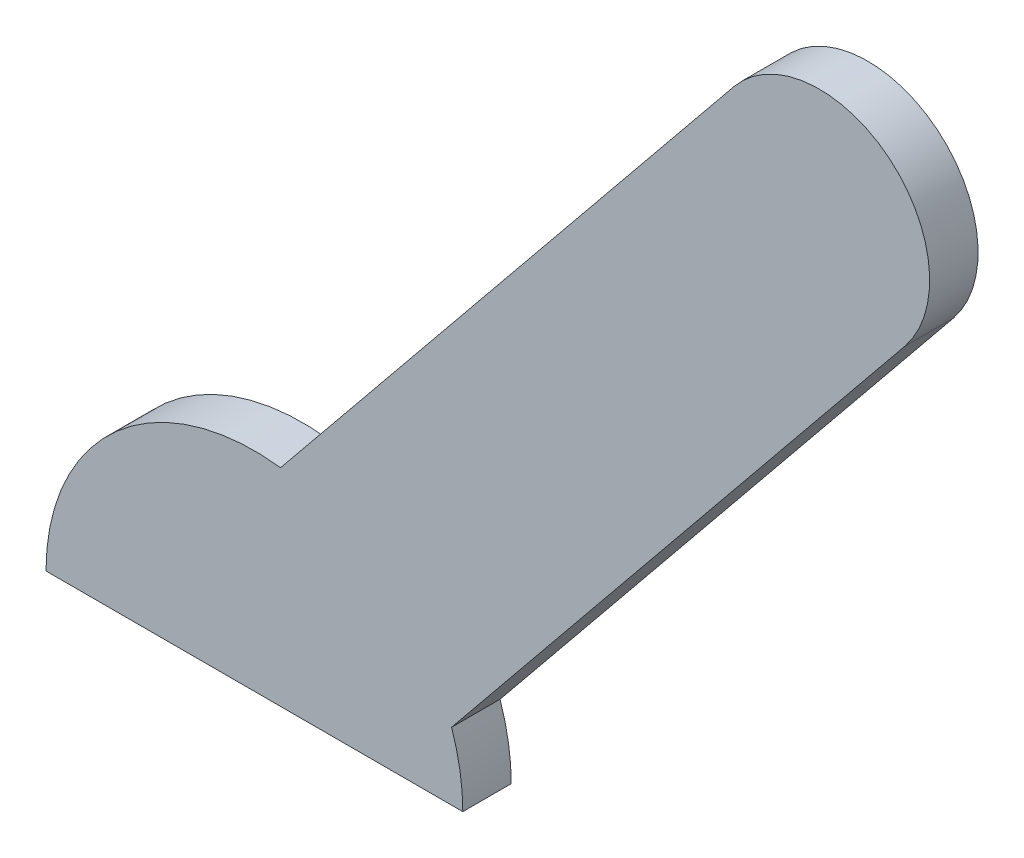
ISO-10303-21;
HEADER;
FILE_DESCRIPTION(('STEP AP214'),'2;1');
FILE_NAME('part.step','',(''),(''),'','','');
FILE_SCHEMA(('AUTOMOTIVE_DESIGN { 1 0 10303 214 1 1 1 1 }'));
ENDSEC;
DATA;
#1=APPLICATION_CONTEXT('core data for automotive mechanical design processes');
#2=APPLICATION_PROTOCOL_DEFINITION('international standard','automotive_design',2000,#1);
#3=PRODUCT_CONTEXT('',#1,'mechanical');
#4=PRODUCT('Part','Part','',(#3));
#5=PRODUCT_RELATED_PRODUCT_CATEGORY('part','',(#4));
#6=PRODUCT_DEFINITION_FORMATION('','',#4);
#7=PRODUCT_DEFINITION_CONTEXT('part definition',#1,'design');
#8=PRODUCT_DEFINITION('design','',#6,#7);
#9=PRODUCT_DEFINITION_SHAPE('','',#8);
#10=(LENGTH_UNIT() NAMED_UNIT(*) SI_UNIT(.MILLI.,.METRE.));
#11=(NAMED_UNIT(*) PLANE_ANGLE_UNIT() SI_UNIT($,.RADIAN.));
#12=(NAMED_UNIT(*) SI_UNIT($,.STERADIAN.) SOLID_ANGLE_UNIT());
#13=UNCERTAINTY_MEASURE_WITH_UNIT(LENGTH_MEASURE(1.E-05),#10,'distance_accuracy_value','');
#14=(GEOMETRIC_REPRESENTATION_CONTEXT(3) GLOBAL_UNCERTAINTY_ASSIGNED_CONTEXT((#13)) GLOBAL_UNIT_ASSIGNED_CONTEXT((#10,
#11,#12)) REPRESENTATION_CONTEXT('',''));
#15=CARTESIAN_POINT('',(0.,0.,0.));
#16=DIRECTION('',(0.,0.,1.));
#17=DIRECTION('',(1.,0.,0.));
#18=AXIS2_PLACEMENT_3D('',#15,#16,#17);
#19=CARTESIAN_POINT('',(-4.48278995600299,3.65047137955239,2.54));
#20=DIRECTION('',(-0.775418958264885,0.631447099259629,0.));
#21=DIRECTION('',(-0.631447099259629,-0.775418958264885,0.));
#22=AXIS2_PLACEMENT_3D('',#19,#20,#21);
#23=PLANE('',#22);
#24=DIRECTION('',(0.631447099259629,0.775418958264885,0.));
#25=VECTOR('',#24,1.);
#26=CARTESIAN_POINT('',(-4.48278995600299,3.65047137955239,0.));
#27=LINE('',#26,#25);
#28=CARTESIAN_POINT('',(1.37164090486324,10.8397302813502,0.));
#29=VERTEX_POINT('',#28);
#30=CARTESIAN_POINT('',(25.136796155568,40.023413204451,0.));
#31=VERTEX_POINT('',#30);
#32=EDGE_CURVE('E141',#29,#31,#27,.T.);
#33=ORIENTED_EDGE('',*,*,#32,.F.);
#34=DIRECTION('',(0.,0.,-1.));
#35=VECTOR('',#34,1.);
#36=CARTESIAN_POINT('',(1.37164090486324,10.8397302813502,2.54));
#37=LINE('',#36,#35);
#38=CARTESIAN_POINT('',(1.37164090486324,10.8397302813502,2.54));
#39=VERTEX_POINT('',#38);
#40=EDGE_CURVE('E11',#39,#29,#37,.T.);
#41=ORIENTED_EDGE('',*,*,#40,.F.);
#42=DIRECTION('',(0.631447099259629,0.775418958264885,0.));
#43=VECTOR('',#42,1.);
#44=CARTESIAN_POINT('',(-4.48278995600299,3.65047137955239,2.54));
#45=LINE('',#44,#43);
#46=CARTESIAN_POINT('',(25.136796155568,40.023413204451,2.54));
#47=VERTEX_POINT('',#46);
#48=EDGE_CURVE('E118',#39,#47,#45,.T.);
#49=ORIENTED_EDGE('',*,*,#48,.T.);
#50=DIRECTION('',(0.,0.,-1.));
#51=VECTOR('',#50,1.);
#52=CARTESIAN_POINT('',(25.136796155568,40.023413204451,2.54));
#53=LINE('',#52,#51);
#54=EDGE_CURVE('E81',#47,#31,#53,.T.);
#55=ORIENTED_EDGE('',*,*,#54,.T.);
#56=EDGE_LOOP('',(#33,#41,#49,#55));
#57=FACE_BOUND('',#56,.T.);
#58=ADVANCED_FACE('F37',(#57),#23,.T.);
#59=CARTESIAN_POINT('',(0.,0.,2.54));
#60=DIRECTION('',(0.,0.,-1.));
#61=DIRECTION('',(-1.,0.,0.));
#62=AXIS2_PLACEMENT_3D('',#59,#60,#61);
#63=CYLINDRICAL_SURFACE('',#62,10.926168191288);
#64=CARTESIAN_POINT('',(0.,0.,0.));
#65=DIRECTION('',(0.,0.,1.));
#66=DIRECTION('',(1.,0.,0.));
#67=AXIS2_PLACEMENT_3D('',#64,#65,#66);
#68=CIRCLE('',#67,10.926168191288);
#69=CARTESIAN_POINT('',(-10.926168191288,0.,0.));
#70=VERTEX_POINT('',#69);
#71=EDGE_CURVE('E139',#70,#29,#68,.F.);
#72=ORIENTED_EDGE('',*,*,#71,.F.);
#73=DIRECTION('',(0.,0.,-1.));
#74=VECTOR('',#73,1.);
#75=CARTESIAN_POINT('',(-10.926168191288,0.,2.54));
#76=LINE('',#75,#74);
#77=CARTESIAN_POINT('',(-10.926168191288,0.,2.54));
#78=VERTEX_POINT('',#77);
#79=EDGE_CURVE('E45',#78,#70,#76,.T.);
#80=ORIENTED_EDGE('',*,*,#79,.F.);
#81=CARTESIAN_POINT('',(0.,0.,2.54));
#82=DIRECTION('',(0.,0.,1.));
#83=DIRECTION('',(1.,0.,0.));
#84=AXIS2_PLACEMENT_3D('',#81,#82,#83);
#85=CIRCLE('',#84,10.926168191288);
#86=EDGE_CURVE('E114',#78,#39,#85,.F.);
#87=ORIENTED_EDGE('',*,*,#86,.T.);
#88=ORIENTED_EDGE('',*,*,#40,.T.);
#89=EDGE_LOOP('',(#72,#80,#87,#88));
#90=FACE_BOUND('',#89,.T.);
#91=ADVANCED_FACE('F140',(#90),#63,.T.);
#92=CARTESIAN_POINT('',(0.,0.,2.54));
#93=DIRECTION('',(0.,1.,0.));
#94=DIRECTION('',(0.,0.,1.));
#95=AXIS2_PLACEMENT_3D('',#92,#93,#94);
#96=PLANE('',#95);
#97=DIRECTION('',(1.,0.,0.));
#98=VECTOR('',#97,1.);
#99=CARTESIAN_POINT('',(0.,0.,0.));
#100=LINE('',#99,#98);
#101=CARTESIAN_POINT('',(10.926168191288,0.,0.));
#102=VERTEX_POINT('',#101);
#103=EDGE_CURVE('E134',#70,#102,#100,.T.);
#104=ORIENTED_EDGE('',*,*,#103,.T.);
#105=DIRECTION('',(0.,0.,-1.));
#106=VECTOR('',#105,1.);
#107=CARTESIAN_POINT('',(10.926168191288,0.,2.54));
#108=LINE('',#107,#106);
#109=CARTESIAN_POINT('',(10.926168191288,0.,2.54));
#110=VERTEX_POINT('',#109);
#111=EDGE_CURVE('E102',#110,#102,#108,.T.);
#112=ORIENTED_EDGE('',*,*,#111,.F.);
#113=DIRECTION('',(1.,0.,0.));
#114=VECTOR('',#113,1.);
#115=CARTESIAN_POINT('',(0.,0.,2.54));
#116=LINE('',#115,#114);
#117=EDGE_CURVE('E111',#78,#110,#116,.T.);
#118=ORIENTED_EDGE('',*,*,#117,.F.);
#119=ORIENTED_EDGE('',*,*,#79,.T.);
#120=EDGE_LOOP('',(#104,#112,#118,#119));
#121=FACE_BOUND('',#120,.T.);
#122=ADVANCED_FACE('F133',(#121),#96,.F.);
#123=CARTESIAN_POINT('',(10.3372208168692,3.53878752224541,0.));
#124=VERTEX_POINT('',#123);
#125=EDGE_CURVE('E101',#124,#102,#68,.F.);
#126=ORIENTED_EDGE('',*,*,#125,.F.);
#127=DIRECTION('',(0.,0.,-1.));
#128=VECTOR('',#127,1.);
#129=CARTESIAN_POINT('',(10.3372208168692,3.53878752224541,2.54));
#130=LINE('',#129,#128);
#131=CARTESIAN_POINT('',(10.3372208168692,3.53878752224541,2.54));
#132=VERTEX_POINT('',#131);
#133=EDGE_CURVE('E95',#132,#124,#130,.T.);
#134=ORIENTED_EDGE('',*,*,#133,.F.);
#135=EDGE_CURVE('E99',#132,#110,#85,.F.);
#136=ORIENTED_EDGE('',*,*,#135,.T.);
#137=ORIENTED_EDGE('',*,*,#111,.T.);
#138=EDGE_LOOP('',(#126,#134,#136,#137));
#139=FACE_BOUND('',#138,.T.);
#140=ADVANCED_FACE('F97',(#139),#63,.T.);
#141=CARTESIAN_POINT('',(4.48278995600299,-3.65047137955239,2.54));
#142=DIRECTION('',(-0.775418958264885,0.63144709925963,0.));
#143=DIRECTION('',(-0.63144709925963,-0.775418958264885,0.));
#144=AXIS2_PLACEMENT_3D('',#141,#142,#143);
#145=PLANE('',#144);
#146=DIRECTION('',(0.63144709925963,0.775418958264885,0.));
#147=VECTOR('',#146,1.);
#148=CARTESIAN_POINT('',(4.48278995600299,-3.65047137955239,0.));
#149=LINE('',#148,#147);
#150=CARTESIAN_POINT('',(34.102376067574,32.7224704453462,0.));
#151=VERTEX_POINT('',#150);
#152=EDGE_CURVE('E74',#124,#151,#149,.T.);
#153=ORIENTED_EDGE('',*,*,#152,.T.);
#154=DIRECTION('',(0.,0.,-1.));
#155=VECTOR('',#154,1.);
#156=CARTESIAN_POINT('',(34.102376067574,32.7224704453462,2.54));
#157=LINE('',#156,#155);
#158=CARTESIAN_POINT('',(34.102376067574,32.7224704453462,2.54));
#159=VERTEX_POINT('',#158);
#160=EDGE_CURVE('E103',#159,#151,#157,.T.);
#161=ORIENTED_EDGE('',*,*,#160,.F.);
#162=DIRECTION('',(0.63144709925963,0.775418958264885,0.));
#163=VECTOR('',#162,1.);
#164=CARTESIAN_POINT('',(4.48278995600299,-3.65047137955239,2.54));
#165=LINE('',#164,#163);
#166=EDGE_CURVE('E105',#132,#159,#165,.T.);
#167=ORIENTED_EDGE('',*,*,#166,.F.);
#168=ORIENTED_EDGE('',*,*,#133,.T.);
#169=EDGE_LOOP('',(#153,#161,#167,#168));
#170=FACE_BOUND('',#169,.T.);
#171=ADVANCED_FACE('F106',(#170),#145,.F.);
#172=CARTESIAN_POINT('',(29.619586111571,36.3729418248986,2.54));
#173=DIRECTION('',(0.,0.,-1.));
#174=DIRECTION('',(-1.,0.,0.));
#175=AXIS2_PLACEMENT_3D('',#172,#173,#174);
#176=CYLINDRICAL_SURFACE('',#175,5.78111988135279);
#177=CARTESIAN_POINT('',(29.619586111571,36.3729418248986,0.));
#178=DIRECTION('',(0.,0.,1.));
#179=DIRECTION('',(1.,0.,0.));
#180=AXIS2_PLACEMENT_3D('',#177,#178,#179);
#181=CIRCLE('',#180,5.78111988135279);
#182=EDGE_CURVE('E120',#151,#31,#181,.T.);
#183=ORIENTED_EDGE('',*,*,#182,.T.);
#184=ORIENTED_EDGE('',*,*,#54,.F.);
#185=CARTESIAN_POINT('',(29.619586111571,36.3729418248986,2.54));
#186=DIRECTION('',(0.,0.,1.));
#187=DIRECTION('',(1.,0.,0.));
#188=AXIS2_PLACEMENT_3D('',#185,#186,#187);
#189=CIRCLE('',#188,5.78111988135279);
#190=EDGE_CURVE('E53',#159,#47,#189,.T.);
#191=ORIENTED_EDGE('',*,*,#190,.F.);
#192=ORIENTED_EDGE('',*,*,#160,.T.);
#193=EDGE_LOOP('',(#183,#184,#191,#192));
#194=FACE_BOUND('',#193,.T.);
#195=ADVANCED_FACE('F158',(#194),#176,.T.);
#196=CARTESIAN_POINT('',(0.,0.,2.54));
#197=DIRECTION('',(0.,0.,1.));
#198=DIRECTION('',(1.,0.,0.));
#199=AXIS2_PLACEMENT_3D('',#196,#197,#198);
#200=PLANE('',#199);
#201=ORIENTED_EDGE('',*,*,#48,.F.);
#202=ORIENTED_EDGE('',*,*,#86,.F.);
#203=ORIENTED_EDGE('',*,*,#117,.T.);
#204=ORIENTED_EDGE('',*,*,#135,.F.);
#205=ORIENTED_EDGE('',*,*,#166,.T.);
#206=ORIENTED_EDGE('',*,*,#190,.T.);
#207=EDGE_LOOP('',(#201,#202,#203,#204,#205,#206));
#208=FACE_BOUND('',#207,.T.);
#209=ADVANCED_FACE('F108',(#208),#200,.T.);
#210=CARTESIAN_POINT('',(0.,0.,0.));
#211=DIRECTION('',(0.,0.,1.));
#212=DIRECTION('',(1.,0.,0.));
#213=AXIS2_PLACEMENT_3D('',#210,#211,#212);
#214=PLANE('',#213);
#215=ORIENTED_EDGE('',*,*,#32,.T.);
#216=ORIENTED_EDGE('',*,*,#182,.F.);
#217=ORIENTED_EDGE('',*,*,#152,.F.);
#218=ORIENTED_EDGE('',*,*,#125,.T.);
#219=ORIENTED_EDGE('',*,*,#103,.F.);
#220=ORIENTED_EDGE('',*,*,#71,.T.);
#221=EDGE_LOOP('',(#215,#216,#217,#218,#219,#220));
#222=FACE_BOUND('',#221,.T.);
#223=ADVANCED_FACE('F138',(#222),#214,.F.);
#224=CLOSED_SHELL('',(#58,#91,#122,#140,#171,#195,#209,#223));
#225=MANIFOLD_SOLID_BREP('B2',#224);
#226=ADVANCED_BREP_SHAPE_REPRESENTATION('',(#18,#225),#14);
#227=SHAPE_DEFINITION_REPRESENTATION(#9,#226);
ENDSEC;
END-ISO-10303-21;
